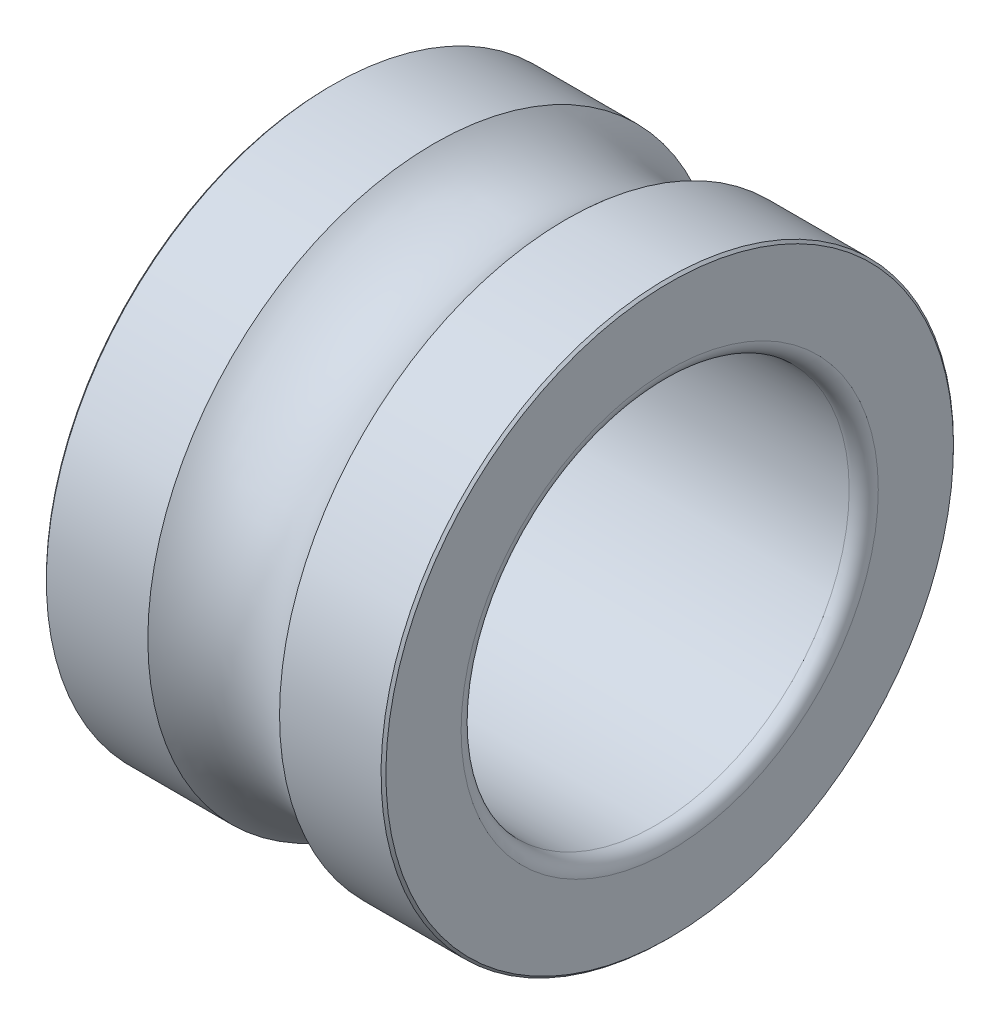
ISO-10303-21;
HEADER;
FILE_DESCRIPTION(('STEP AP214'),'2;1');
FILE_NAME('part.step','',(''),(''),'','','');
FILE_SCHEMA(('AUTOMOTIVE_DESIGN { 1 0 10303 214 1 1 1 1 }'));
ENDSEC;
DATA;
#1=APPLICATION_CONTEXT('core data for automotive mechanical design processes');
#2=APPLICATION_PROTOCOL_DEFINITION('international standard','automotive_design',2000,#1);
#3=PRODUCT_CONTEXT('',#1,'mechanical');
#4=PRODUCT('Part','Part','',(#3));
#5=PRODUCT_RELATED_PRODUCT_CATEGORY('part','',(#4));
#6=PRODUCT_DEFINITION_FORMATION('','',#4);
#7=PRODUCT_DEFINITION_CONTEXT('part definition',#1,'design');
#8=PRODUCT_DEFINITION('design','',#6,#7);
#9=PRODUCT_DEFINITION_SHAPE('','',#8);
#10=(LENGTH_UNIT() NAMED_UNIT(*) SI_UNIT(.MILLI.,.METRE.));
#11=(NAMED_UNIT(*) PLANE_ANGLE_UNIT() SI_UNIT($,.RADIAN.));
#12=(NAMED_UNIT(*) SI_UNIT($,.STERADIAN.) SOLID_ANGLE_UNIT());
#13=UNCERTAINTY_MEASURE_WITH_UNIT(LENGTH_MEASURE(1.E-05),#10,'distance_accuracy_value','');
#14=(GEOMETRIC_REPRESENTATION_CONTEXT(3) GLOBAL_UNCERTAINTY_ASSIGNED_CONTEXT((#13)) GLOBAL_UNIT_ASSIGNED_CONTEXT((#10,
#11,#12)) REPRESENTATION_CONTEXT('',''));
#15=CARTESIAN_POINT('',(0.,0.,0.));
#16=DIRECTION('',(0.,0.,1.));
#17=DIRECTION('',(1.,0.,0.));
#18=AXIS2_PLACEMENT_3D('',#15,#16,#17);
#19=CARTESIAN_POINT('',(-3.5,0.,0.));
#20=DIRECTION('',(1.,0.,0.));
#21=DIRECTION('',(0.,0.,-1.));
#22=AXIS2_PLACEMENT_3D('',#19,#20,#21);
#23=CYLINDRICAL_SURFACE('',#22,4.);
#24=CARTESIAN_POINT('',(-3.2,0.,0.));
#25=DIRECTION('',(-1.,0.,0.));
#26=DIRECTION('',(0.,0.,1.));
#27=AXIS2_PLACEMENT_3D('',#24,#25,#26);
#28=CIRCLE('',#27,4.);
#29=CARTESIAN_POINT('',(-3.2,0.,4.));
#30=VERTEX_POINT('',#29);
#31=EDGE_CURVE('E86',#30,#30,#28,.F.);
#32=ORIENTED_EDGE('',*,*,#31,.F.);
#33=EDGE_LOOP('',(#32));
#34=FACE_BOUND('',#33,.T.);
#35=CARTESIAN_POINT('',(3.2,0.,0.));
#36=DIRECTION('',(-1.,0.,0.));
#37=DIRECTION('',(0.,0.,1.));
#38=AXIS2_PLACEMENT_3D('',#35,#36,#37);
#39=CIRCLE('',#38,4.);
#40=CARTESIAN_POINT('',(3.2,0.,4.));
#41=VERTEX_POINT('',#40);
#42=EDGE_CURVE('E81',#41,#41,#39,.T.);
#43=ORIENTED_EDGE('',*,*,#42,.F.);
#44=EDGE_LOOP('',(#43));
#45=FACE_BOUND('',#44,.T.);
#46=ADVANCED_FACE('F14',(#34,#45),#23,.F.);
#47=CARTESIAN_POINT('',(-3.2,0.,0.));
#48=DIRECTION('',(-1.,0.,0.));
#49=DIRECTION('',(0.,0.,1.));
#50=AXIS2_PLACEMENT_3D('',#47,#48,#49);
#51=TOROIDAL_SURFACE('',#50,4.3,0.3);
#52=ORIENTED_EDGE('',*,*,#31,.T.);
#53=EDGE_LOOP('',(#52));
#54=FACE_BOUND('',#53,.T.);
#55=CARTESIAN_POINT('',(-3.5,0.,0.));
#56=DIRECTION('',(-1.,0.,0.));
#57=DIRECTION('',(0.,0.,-1.));
#58=AXIS2_PLACEMENT_3D('',#55,#56,#57);
#59=CIRCLE('',#58,4.3);
#60=CARTESIAN_POINT('',(-3.5,0.,-4.3));
#61=VERTEX_POINT('',#60);
#62=EDGE_CURVE('E85',#61,#61,#59,.T.);
#63=ORIENTED_EDGE('',*,*,#62,.T.);
#64=EDGE_LOOP('',(#63));
#65=FACE_BOUND('',#64,.T.);
#66=ADVANCED_FACE('F100',(#54,#65),#51,.T.);
#67=CARTESIAN_POINT('',(3.2,0.,0.));
#68=DIRECTION('',(-1.,0.,0.));
#69=DIRECTION('',(0.,0.,1.));
#70=AXIS2_PLACEMENT_3D('',#67,#68,#69);
#71=TOROIDAL_SURFACE('',#70,4.3,0.3);
#72=CARTESIAN_POINT('',(3.5,0.,0.));
#73=DIRECTION('',(1.,0.,0.));
#74=DIRECTION('',(0.,0.,1.));
#75=AXIS2_PLACEMENT_3D('',#72,#73,#74);
#76=CIRCLE('',#75,4.3);
#77=CARTESIAN_POINT('',(3.5,0.,4.3));
#78=VERTEX_POINT('',#77);
#79=EDGE_CURVE('E39',#78,#78,#76,.T.);
#80=ORIENTED_EDGE('',*,*,#79,.T.);
#81=EDGE_LOOP('',(#80));
#82=FACE_BOUND('',#81,.T.);
#83=ORIENTED_EDGE('',*,*,#42,.T.);
#84=EDGE_LOOP('',(#83));
#85=FACE_BOUND('',#84,.T.);
#86=ADVANCED_FACE('F61',(#82,#85),#71,.T.);
#87=CARTESIAN_POINT('',(-3.5,4.3,0.));
#88=DIRECTION('',(1.,0.,0.));
#89=DIRECTION('',(0.,0.,-1.));
#90=AXIS2_PLACEMENT_3D('',#87,#88,#89);
#91=PLANE('',#90);
#92=ORIENTED_EDGE('',*,*,#62,.F.);
#93=EDGE_LOOP('',(#92));
#94=FACE_BOUND('',#93,.T.);
#95=CARTESIAN_POINT('',(-3.50000000003092,0.,0.));
#96=DIRECTION('',(1.,0.,0.));
#97=DIRECTION('',(0.,0.,-1.));
#98=AXIS2_PLACEMENT_3D('',#95,#96,#97);
#99=CIRCLE('',#98,5.85000000000946);
#100=CARTESIAN_POINT('',(-3.50000000003092,0.,-5.85000000000946));
#101=VERTEX_POINT('',#100);
#102=EDGE_CURVE('E17',#101,#101,#99,.T.);
#103=ORIENTED_EDGE('',*,*,#102,.F.);
#104=EDGE_LOOP('',(#103));
#105=FACE_BOUND('',#104,.T.);
#106=ADVANCED_FACE('F56',(#94,#105),#91,.F.);
#107=CARTESIAN_POINT('',(3.5,5.85,0.));
#108=DIRECTION('',(-1.,0.,0.));
#109=DIRECTION('',(0.,0.,1.));
#110=AXIS2_PLACEMENT_3D('',#107,#108,#109);
#111=PLANE('',#110);
#112=ORIENTED_EDGE('',*,*,#79,.F.);
#113=EDGE_LOOP('',(#112));
#114=FACE_BOUND('',#113,.T.);
#115=CARTESIAN_POINT('',(3.50000000003092,0.,0.));
#116=DIRECTION('',(-1.,0.,0.));
#117=DIRECTION('',(0.,-1.,0.));
#118=AXIS2_PLACEMENT_3D('',#115,#116,#117);
#119=CIRCLE('',#118,5.85000000000946);
#120=CARTESIAN_POINT('',(3.50000000003092,-5.85000000000946,0.));
#121=VERTEX_POINT('',#120);
#122=EDGE_CURVE('E78',#121,#121,#119,.T.);
#123=ORIENTED_EDGE('',*,*,#122,.F.);
#124=EDGE_LOOP('',(#123));
#125=FACE_BOUND('',#124,.T.);
#126=ADVANCED_FACE('F45',(#114,#125),#111,.F.);
#127=CARTESIAN_POINT('',(-3.44999999998663,0.,0.));
#128=DIRECTION('',(1.,0.,0.));
#129=DIRECTION('',(0.,0.,-1.));
#130=AXIS2_PLACEMENT_3D('',#127,#128,#129);
#131=CONICAL_SURFACE('',#130,5.90000000005375,0.785398163397448);
#132=CARTESIAN_POINT('',(-3.45,0.,0.));
#133=DIRECTION('',(1.,0.,0.));
#134=DIRECTION('',(0.,0.,-1.));
#135=AXIS2_PLACEMENT_3D('',#132,#133,#134);
#136=CIRCLE('',#135,5.9);
#137=CARTESIAN_POINT('',(-3.45,0.,-5.9));
#138=VERTEX_POINT('',#137);
#139=EDGE_CURVE('E70',#138,#138,#136,.T.);
#140=ORIENTED_EDGE('',*,*,#139,.F.);
#141=EDGE_LOOP('',(#140));
#142=FACE_BOUND('',#141,.T.);
#143=ORIENTED_EDGE('',*,*,#102,.T.);
#144=EDGE_LOOP('',(#143));
#145=FACE_BOUND('',#144,.T.);
#146=ADVANCED_FACE('F55',(#142,#145),#131,.T.);
#147=CARTESIAN_POINT('',(3.45000000010032,0.,0.));
#148=DIRECTION('',(-1.,0.,0.));
#149=DIRECTION('',(0.,-1.,0.));
#150=AXIS2_PLACEMENT_3D('',#147,#148,#149);
#151=CONICAL_SURFACE('',#150,5.89999999988322,0.785398162829014);
#152=ORIENTED_EDGE('',*,*,#122,.T.);
#153=EDGE_LOOP('',(#152));
#154=FACE_BOUND('',#153,.T.);
#155=CARTESIAN_POINT('',(3.45,0.,0.));
#156=DIRECTION('',(1.,0.,0.));
#157=DIRECTION('',(0.,0.,-1.));
#158=AXIS2_PLACEMENT_3D('',#155,#156,#157);
#159=CIRCLE('',#158,5.9);
#160=CARTESIAN_POINT('',(3.45,0.,-5.9));
#161=VERTEX_POINT('',#160);
#162=EDGE_CURVE('E30',#161,#161,#159,.F.);
#163=ORIENTED_EDGE('',*,*,#162,.F.);
#164=EDGE_LOOP('',(#163));
#165=FACE_BOUND('',#164,.T.);
#166=ADVANCED_FACE('F129',(#154,#165),#151,.T.);
#167=CARTESIAN_POINT('',(-3.5,0.,0.));
#168=DIRECTION('',(1.,0.,0.));
#169=DIRECTION('',(0.,0.,-1.));
#170=AXIS2_PLACEMENT_3D('',#167,#168,#169);
#171=CYLINDRICAL_SURFACE('',#170,5.9);
#172=ORIENTED_EDGE('',*,*,#139,.T.);
#173=EDGE_LOOP('',(#172));
#174=FACE_BOUND('',#173,.T.);
#175=CARTESIAN_POINT('',(-1.3575654680346,0.,0.));
#176=DIRECTION('',(-1.,0.,0.));
#177=DIRECTION('',(0.,0.,1.));
#178=AXIS2_PLACEMENT_3D('',#175,#176,#177);
#179=CIRCLE('',#178,5.9);
#180=CARTESIAN_POINT('',(-1.3575654680346,0.,5.9));
#181=VERTEX_POINT('',#180);
#182=EDGE_CURVE('E22',#181,#181,#179,.T.);
#183=ORIENTED_EDGE('',*,*,#182,.T.);
#184=EDGE_LOOP('',(#183));
#185=FACE_BOUND('',#184,.T.);
#186=ADVANCED_FACE('F135',(#174,#185),#171,.T.);
#187=CARTESIAN_POINT('',(-3.5,0.,0.));
#188=DIRECTION('',(1.,0.,0.));
#189=DIRECTION('',(0.,0.,-1.));
#190=AXIS2_PLACEMENT_3D('',#187,#188,#189);
#191=CYLINDRICAL_SURFACE('',#190,5.9);
#192=ORIENTED_EDGE('',*,*,#162,.T.);
#193=EDGE_LOOP('',(#192));
#194=FACE_BOUND('',#193,.T.);
#195=CARTESIAN_POINT('',(1.3575654680346,0.,0.));
#196=DIRECTION('',(-1.,0.,0.));
#197=DIRECTION('',(0.,0.,1.));
#198=AXIS2_PLACEMENT_3D('',#195,#196,#197);
#199=CIRCLE('',#198,5.9);
#200=CARTESIAN_POINT('',(1.3575654680346,0.,5.9));
#201=VERTEX_POINT('',#200);
#202=EDGE_CURVE('E10',#201,#201,#199,.F.);
#203=ORIENTED_EDGE('',*,*,#202,.T.);
#204=EDGE_LOOP('',(#203));
#205=FACE_BOUND('',#204,.T.);
#206=ADVANCED_FACE('F139',(#194,#205),#191,.T.);
#207=CARTESIAN_POINT('',(0.,0.,0.));
#208=DIRECTION('',(-1.,0.,0.));
#209=DIRECTION('',(0.,0.,1.));
#210=AXIS2_PLACEMENT_3D('',#207,#208,#209);
#211=TOROIDAL_SURFACE('',#210,7.3475,1.9845);
#212=ORIENTED_EDGE('',*,*,#202,.F.);
#213=EDGE_LOOP('',(#212));
#214=FACE_BOUND('',#213,.T.);
#215=ORIENTED_EDGE('',*,*,#182,.F.);
#216=EDGE_LOOP('',(#215));
#217=FACE_BOUND('',#216,.T.);
#218=ADVANCED_FACE('F137',(#214,#217),#211,.F.);
#219=CLOSED_SHELL('',(#46,#66,#86,#106,#126,#146,#166,#186,#206,#218));
#220=MANIFOLD_SOLID_BREP('B1',#219);
#221=ADVANCED_BREP_SHAPE_REPRESENTATION('',(#18,#220),#14);
#222=SHAPE_DEFINITION_REPRESENTATION(#9,#221);
ENDSEC;
END-ISO-10303-21;
